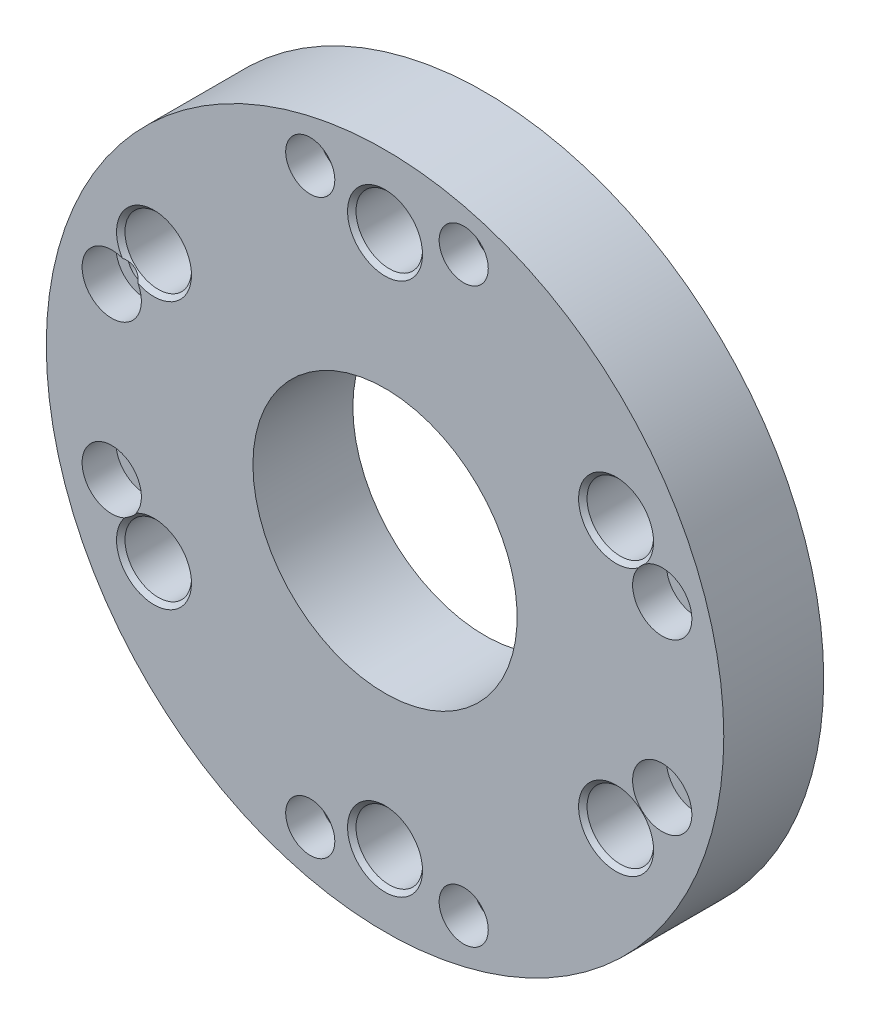
ISO-10303-21;
HEADER;
FILE_DESCRIPTION(('STEP AP214'),'2;1');
FILE_NAME('part.step','',(''),(''),'','','');
FILE_SCHEMA(('AUTOMOTIVE_DESIGN { 1 0 10303 214 1 1 1 1 }'));
ENDSEC;
DATA;
#1=APPLICATION_CONTEXT('core data for automotive mechanical design processes');
#2=APPLICATION_PROTOCOL_DEFINITION('international standard','automotive_design',2000,#1);
#3=PRODUCT_CONTEXT('',#1,'mechanical');
#4=PRODUCT('Part','Part','',(#3));
#5=PRODUCT_RELATED_PRODUCT_CATEGORY('part','',(#4));
#6=PRODUCT_DEFINITION_FORMATION('','',#4);
#7=PRODUCT_DEFINITION_CONTEXT('part definition',#1,'design');
#8=PRODUCT_DEFINITION('design','',#6,#7);
#9=PRODUCT_DEFINITION_SHAPE('','',#8);
#10=(LENGTH_UNIT() NAMED_UNIT(*) SI_UNIT(.MILLI.,.METRE.));
#11=(NAMED_UNIT(*) PLANE_ANGLE_UNIT() SI_UNIT($,.RADIAN.));
#12=(NAMED_UNIT(*) SI_UNIT($,.STERADIAN.) SOLID_ANGLE_UNIT());
#13=UNCERTAINTY_MEASURE_WITH_UNIT(LENGTH_MEASURE(1.E-05),#10,'distance_accuracy_value','');
#14=(GEOMETRIC_REPRESENTATION_CONTEXT(3) GLOBAL_UNCERTAINTY_ASSIGNED_CONTEXT((#13)) GLOBAL_UNIT_ASSIGNED_CONTEXT((#10,
#11,#12)) REPRESENTATION_CONTEXT('',''));
#15=CARTESIAN_POINT('',(0.,0.,0.));
#16=DIRECTION('',(0.,0.,1.));
#17=DIRECTION('',(1.,0.,0.));
#18=AXIS2_PLACEMENT_3D('',#15,#16,#17);
#19=CARTESIAN_POINT('',(32.7306438468949,10.1245664997554,11.8));
#20=DIRECTION('',(0.,0.,-1.));
#21=DIRECTION('',(-1.,0.,0.));
#22=AXIS2_PLACEMENT_3D('',#19,#20,#21);
#23=CYLINDRICAL_SURFACE('',#22,2.15);
#24=CARTESIAN_POINT('',(32.7306438468949,10.1245664997554,0.));
#25=DIRECTION('',(0.,0.,-1.));
#26=DIRECTION('',(-1.,0.,0.));
#27=AXIS2_PLACEMENT_3D('',#24,#25,#26);
#28=CIRCLE('',#27,2.15);
#29=CARTESIAN_POINT('',(30.5806438468949,10.1245664997554,0.));
#30=VERTEX_POINT('',#29);
#31=EDGE_CURVE('E189',#30,#30,#28,.T.);
#32=ORIENTED_EDGE('',*,*,#31,.T.);
#33=EDGE_LOOP('',(#32));
#34=FACE_BOUND('',#33,.T.);
#35=CARTESIAN_POINT('',(32.7306438468949,10.1245664997554,7.8));
#36=DIRECTION('',(0.,0.,1.));
#37=DIRECTION('',(1.,0.,0.));
#38=AXIS2_PLACEMENT_3D('',#35,#36,#37);
#39=CIRCLE('',#38,2.15);
#40=CARTESIAN_POINT('',(34.8806438468949,10.1245664997554,7.8));
#41=VERTEX_POINT('',#40);
#42=EDGE_CURVE('E173',#41,#41,#39,.F.);
#43=ORIENTED_EDGE('',*,*,#42,.F.);
#44=EDGE_LOOP('',(#43));
#45=FACE_BOUND('',#44,.T.);
#46=ADVANCED_FACE('F45',(#34,#45),#23,.F.);
#47=CARTESIAN_POINT('',(9.29064384689489,-33.6854335002446,11.8));
#48=DIRECTION('',(0.,0.,-1.));
#49=DIRECTION('',(-1.,0.,0.));
#50=AXIS2_PLACEMENT_3D('',#47,#48,#49);
#51=CYLINDRICAL_SURFACE('',#50,1.75);
#52=CARTESIAN_POINT('',(9.29064384689489,-33.6854335002446,0.));
#53=DIRECTION('',(0.,0.,-1.));
#54=DIRECTION('',(1.,0.,0.));
#55=AXIS2_PLACEMENT_3D('',#52,#53,#54);
#56=CIRCLE('',#55,1.75);
#57=CARTESIAN_POINT('',(11.0406438468949,-33.6854335002446,0.));
#58=VERTEX_POINT('',#57);
#59=EDGE_CURVE('E144',#58,#58,#56,.T.);
#60=ORIENTED_EDGE('',*,*,#59,.T.);
#61=EDGE_LOOP('',(#60));
#62=FACE_BOUND('',#61,.T.);
#63=CARTESIAN_POINT('',(9.29064384689489,-33.6854335002446,7.8));
#64=DIRECTION('',(0.,0.,1.));
#65=DIRECTION('',(1.,0.,0.));
#66=AXIS2_PLACEMENT_3D('',#63,#64,#65);
#67=CIRCLE('',#66,1.75);
#68=CARTESIAN_POINT('',(11.0406438468949,-33.6854335002446,7.8));
#69=VERTEX_POINT('',#68);
#70=EDGE_CURVE('E236',#69,#69,#67,.F.);
#71=ORIENTED_EDGE('',*,*,#70,.F.);
#72=EDGE_LOOP('',(#71));
#73=FACE_BOUND('',#72,.T.);
#74=ADVANCED_FACE('F327',(#62,#73),#51,.F.);
#75=CARTESIAN_POINT('',(-8.82935615310511,-33.6854335002446,11.8));
#76=DIRECTION('',(0.,0.,-1.));
#77=DIRECTION('',(-1.,0.,0.));
#78=AXIS2_PLACEMENT_3D('',#75,#76,#77);
#79=CYLINDRICAL_SURFACE('',#78,1.75);
#80=CARTESIAN_POINT('',(-8.82935615310511,-33.6854335002446,0.));
#81=DIRECTION('',(0.,0.,-1.));
#82=DIRECTION('',(-1.,0.,0.));
#83=AXIS2_PLACEMENT_3D('',#80,#81,#82);
#84=CIRCLE('',#83,1.75);
#85=CARTESIAN_POINT('',(-10.5793561531051,-33.6854335002446,0.));
#86=VERTEX_POINT('',#85);
#87=EDGE_CURVE('E178',#86,#86,#84,.T.);
#88=ORIENTED_EDGE('',*,*,#87,.T.);
#89=EDGE_LOOP('',(#88));
#90=FACE_BOUND('',#89,.T.);
#91=CARTESIAN_POINT('',(-8.82935615310511,-33.6854335002446,7.8));
#92=DIRECTION('',(0.,0.,1.));
#93=DIRECTION('',(1.,0.,0.));
#94=AXIS2_PLACEMENT_3D('',#91,#92,#93);
#95=CIRCLE('',#94,1.75);
#96=CARTESIAN_POINT('',(-7.07935615310511,-33.6854335002446,7.8));
#97=VERTEX_POINT('',#96);
#98=EDGE_CURVE('E232',#97,#97,#95,.F.);
#99=ORIENTED_EDGE('',*,*,#98,.F.);
#100=EDGE_LOOP('',(#99));
#101=FACE_BOUND('',#100,.T.);
#102=ADVANCED_FACE('F332',(#90,#101),#79,.F.);
#103=CARTESIAN_POINT('',(-8.82935615310511,33.9345664997554,11.8));
#104=DIRECTION('',(0.,0.,-1.));
#105=DIRECTION('',(-1.,0.,0.));
#106=AXIS2_PLACEMENT_3D('',#103,#104,#105);
#107=CYLINDRICAL_SURFACE('',#106,1.75);
#108=CARTESIAN_POINT('',(-8.82935615310511,33.9345664997554,0.));
#109=DIRECTION('',(0.,0.,-1.));
#110=DIRECTION('',(1.,0.,0.));
#111=AXIS2_PLACEMENT_3D('',#108,#109,#110);
#112=CIRCLE('',#111,1.75);
#113=CARTESIAN_POINT('',(-7.07935615310511,33.9345664997554,0.));
#114=VERTEX_POINT('',#113);
#115=EDGE_CURVE('E174',#114,#114,#112,.T.);
#116=ORIENTED_EDGE('',*,*,#115,.T.);
#117=EDGE_LOOP('',(#116));
#118=FACE_BOUND('',#117,.T.);
#119=CARTESIAN_POINT('',(-8.82935615310511,33.9345664997554,7.8));
#120=DIRECTION('',(0.,0.,1.));
#121=DIRECTION('',(1.,0.,0.));
#122=AXIS2_PLACEMENT_3D('',#119,#120,#121);
#123=CIRCLE('',#122,1.75);
#124=CARTESIAN_POINT('',(-7.07935615310511,33.9345664997554,7.8));
#125=VERTEX_POINT('',#124);
#126=EDGE_CURVE('E228',#125,#125,#123,.F.);
#127=ORIENTED_EDGE('',*,*,#126,.F.);
#128=EDGE_LOOP('',(#127));
#129=FACE_BOUND('',#128,.T.);
#130=ADVANCED_FACE('F513',(#118,#129),#107,.F.);
#131=CARTESIAN_POINT('',(9.29064384689489,33.9345664997554,11.8));
#132=DIRECTION('',(0.,0.,-1.));
#133=DIRECTION('',(-1.,0.,0.));
#134=AXIS2_PLACEMENT_3D('',#131,#132,#133);
#135=CYLINDRICAL_SURFACE('',#134,1.75);
#136=CARTESIAN_POINT('',(9.29064384689489,33.9345664997554,0.));
#137=DIRECTION('',(0.,0.,-1.));
#138=DIRECTION('',(-1.,0.,0.));
#139=AXIS2_PLACEMENT_3D('',#136,#137,#138);
#140=CIRCLE('',#139,1.75);
#141=CARTESIAN_POINT('',(7.54064384689489,33.9345664997554,0.));
#142=VERTEX_POINT('',#141);
#143=EDGE_CURVE('E177',#142,#142,#140,.T.);
#144=ORIENTED_EDGE('',*,*,#143,.T.);
#145=EDGE_LOOP('',(#144));
#146=FACE_BOUND('',#145,.T.);
#147=CARTESIAN_POINT('',(9.29064384689489,33.9345664997554,7.8));
#148=DIRECTION('',(0.,0.,1.));
#149=DIRECTION('',(1.,0.,0.));
#150=AXIS2_PLACEMENT_3D('',#147,#148,#149);
#151=CIRCLE('',#150,1.75);
#152=CARTESIAN_POINT('',(11.0406438468949,33.9345664997554,7.8));
#153=VERTEX_POINT('',#152);
#154=EDGE_CURVE('E224',#153,#153,#151,.F.);
#155=ORIENTED_EDGE('',*,*,#154,.F.);
#156=EDGE_LOOP('',(#155));
#157=FACE_BOUND('',#156,.T.);
#158=ADVANCED_FACE('F338',(#146,#157),#135,.F.);
#159=CARTESIAN_POINT('',(-32.2693561531051,10.1245664997554,11.8));
#160=DIRECTION('',(0.,0.,-1.));
#161=DIRECTION('',(-1.,0.,0.));
#162=AXIS2_PLACEMENT_3D('',#159,#160,#161);
#163=CYLINDRICAL_SURFACE('',#162,2.15);
#164=CARTESIAN_POINT('',(-32.2693561531051,10.1245664997554,0.));
#165=DIRECTION('',(0.,0.,-1.));
#166=DIRECTION('',(1.,0.,0.));
#167=AXIS2_PLACEMENT_3D('',#164,#165,#166);
#168=CIRCLE('',#167,2.15);
#169=CARTESIAN_POINT('',(-30.1193561531051,10.1245664997554,0.));
#170=VERTEX_POINT('',#169);
#171=EDGE_CURVE('E194',#170,#170,#168,.T.);
#172=ORIENTED_EDGE('',*,*,#171,.T.);
#173=EDGE_LOOP('',(#172));
#174=FACE_BOUND('',#173,.T.);
#175=CARTESIAN_POINT('',(-32.2693561531051,10.1245664997554,7.8));
#176=DIRECTION('',(0.,0.,1.));
#177=DIRECTION('',(1.,0.,0.));
#178=AXIS2_PLACEMENT_3D('',#175,#176,#177);
#179=CIRCLE('',#178,2.15);
#180=CARTESIAN_POINT('',(-30.1193561531051,10.1245664997554,7.8));
#181=VERTEX_POINT('',#180);
#182=EDGE_CURVE('E220',#181,#181,#179,.F.);
#183=ORIENTED_EDGE('',*,*,#182,.F.);
#184=EDGE_LOOP('',(#183));
#185=FACE_BOUND('',#184,.T.);
#186=ADVANCED_FACE('F525',(#174,#185),#163,.F.);
#187=CARTESIAN_POINT('',(-32.2693561531051,-9.87543350024464,11.8));
#188=DIRECTION('',(0.,0.,-1.));
#189=DIRECTION('',(-1.,0.,0.));
#190=AXIS2_PLACEMENT_3D('',#187,#188,#189);
#191=CYLINDRICAL_SURFACE('',#190,2.15);
#192=CARTESIAN_POINT('',(-32.2693561531051,-9.87543350024464,0.));
#193=DIRECTION('',(0.,0.,-1.));
#194=DIRECTION('',(-1.,0.,0.));
#195=AXIS2_PLACEMENT_3D('',#192,#193,#194);
#196=CIRCLE('',#195,2.15);
#197=CARTESIAN_POINT('',(-34.4193561531051,-9.87543350024464,0.));
#198=VERTEX_POINT('',#197);
#199=EDGE_CURVE('E190',#198,#198,#196,.T.);
#200=ORIENTED_EDGE('',*,*,#199,.T.);
#201=EDGE_LOOP('',(#200));
#202=FACE_BOUND('',#201,.T.);
#203=CARTESIAN_POINT('',(-32.2693561531051,-9.87543350024464,7.8));
#204=DIRECTION('',(0.,0.,1.));
#205=DIRECTION('',(1.,0.,0.));
#206=AXIS2_PLACEMENT_3D('',#203,#204,#205);
#207=CIRCLE('',#206,2.15);
#208=CARTESIAN_POINT('',(-30.1193561531051,-9.87543350024464,7.8));
#209=VERTEX_POINT('',#208);
#210=EDGE_CURVE('E216',#209,#209,#207,.F.);
#211=ORIENTED_EDGE('',*,*,#210,.F.);
#212=EDGE_LOOP('',(#211));
#213=FACE_BOUND('',#212,.T.);
#214=ADVANCED_FACE('F522',(#202,#213),#191,.F.);
#215=CARTESIAN_POINT('',(32.7306438468949,-9.87543350024464,11.8));
#216=DIRECTION('',(0.,0.,-1.));
#217=DIRECTION('',(-1.,0.,0.));
#218=AXIS2_PLACEMENT_3D('',#215,#216,#217);
#219=CYLINDRICAL_SURFACE('',#218,2.15);
#220=CARTESIAN_POINT('',(32.7306438468949,-9.87543350024464,0.));
#221=DIRECTION('',(0.,0.,-1.));
#222=DIRECTION('',(1.,0.,0.));
#223=AXIS2_PLACEMENT_3D('',#220,#221,#222);
#224=CIRCLE('',#223,2.15);
#225=CARTESIAN_POINT('',(34.8806438468949,-9.87543350024464,0.));
#226=VERTEX_POINT('',#225);
#227=EDGE_CURVE('E185',#226,#226,#224,.T.);
#228=ORIENTED_EDGE('',*,*,#227,.T.);
#229=EDGE_LOOP('',(#228));
#230=FACE_BOUND('',#229,.T.);
#231=CARTESIAN_POINT('',(32.7306438468949,-9.87543350024464,7.8));
#232=DIRECTION('',(0.,0.,1.));
#233=DIRECTION('',(1.,0.,0.));
#234=AXIS2_PLACEMENT_3D('',#231,#232,#233);
#235=CIRCLE('',#234,2.15);
#236=CARTESIAN_POINT('',(34.8806438468949,-9.87543350024464,7.8));
#237=VERTEX_POINT('',#236);
#238=EDGE_CURVE('E137',#237,#237,#235,.F.);
#239=ORIENTED_EDGE('',*,*,#238,.F.);
#240=EDGE_LOOP('',(#239));
#241=FACE_BOUND('',#240,.T.);
#242=ADVANCED_FACE('F350',(#230,#241),#219,.F.);
#243=CARTESIAN_POINT('',(0.,0.,11.8));
#244=DIRECTION('',(0.,0.,-1.));
#245=DIRECTION('',(-1.,0.,0.));
#246=AXIS2_PLACEMENT_3D('',#243,#244,#245);
#247=CYLINDRICAL_SURFACE('',#246,40.);
#248=CARTESIAN_POINT('',(0.,0.,11.8));
#249=DIRECTION('',(0.,0.,1.));
#250=DIRECTION('',(1.,0.,0.));
#251=AXIS2_PLACEMENT_3D('',#248,#249,#250);
#252=CIRCLE('',#251,40.);
#253=CARTESIAN_POINT('',(40.,0.,11.8));
#254=VERTEX_POINT('',#253);
#255=EDGE_CURVE('E205',#254,#254,#252,.T.);
#256=ORIENTED_EDGE('',*,*,#255,.F.);
#257=EDGE_LOOP('',(#256));
#258=FACE_BOUND('',#257,.T.);
#259=CARTESIAN_POINT('',(0.,0.,0.));
#260=DIRECTION('',(0.,0.,1.));
#261=DIRECTION('',(1.,0.,0.));
#262=AXIS2_PLACEMENT_3D('',#259,#260,#261);
#263=CIRCLE('',#262,40.);
#264=CARTESIAN_POINT('',(40.,0.,0.));
#265=VERTEX_POINT('',#264);
#266=EDGE_CURVE('E204',#265,#265,#263,.T.);
#267=ORIENTED_EDGE('',*,*,#266,.T.);
#268=EDGE_LOOP('',(#267));
#269=FACE_BOUND('',#268,.T.);
#270=ADVANCED_FACE('F343',(#258,#269),#247,.T.);
#271=CARTESIAN_POINT('',(0.,0.,11.8));
#272=DIRECTION('',(0.,0.,1.));
#273=DIRECTION('',(1.,0.,0.));
#274=AXIS2_PLACEMENT_3D('',#271,#272,#273);
#275=PLANE('',#274);
#276=CARTESIAN_POINT('',(2.19963324347117E-13,-31.5,11.8));
#277=DIRECTION('',(0.,0.,1.));
#278=DIRECTION('',(1.,0.,0.));
#279=AXIS2_PLACEMENT_3D('',#276,#277,#278);
#280=CIRCLE('',#279,4.425);
#281=CARTESIAN_POINT('',(4.42500000000022,-31.5,11.8));
#282=VERTEX_POINT('',#281);
#283=EDGE_CURVE('E255',#282,#282,#280,.F.);
#284=ORIENTED_EDGE('',*,*,#283,.T.);
#285=EDGE_LOOP('',(#284));
#286=FACE_BOUND('',#285,.T.);
#287=CARTESIAN_POINT('',(27.27980021921,-15.7499999999997,11.8));
#288=DIRECTION('',(0.,0.,1.));
#289=DIRECTION('',(1.,0.,0.));
#290=AXIS2_PLACEMENT_3D('',#287,#288,#289);
#291=CIRCLE('',#290,4.42500000000001);
#292=CARTESIAN_POINT('',(31.70480021921,-15.7499999999997,11.8));
#293=VERTEX_POINT('',#292);
#294=EDGE_CURVE('E96',#293,#293,#291,.F.);
#295=ORIENTED_EDGE('',*,*,#294,.T.);
#296=EDGE_LOOP('',(#295));
#297=FACE_BOUND('',#296,.T.);
#298=CARTESIAN_POINT('',(0.,31.5,11.8));
#299=DIRECTION('',(0.,0.,1.));
#300=DIRECTION('',(1.,0.,0.));
#301=AXIS2_PLACEMENT_3D('',#298,#299,#300);
#302=CIRCLE('',#301,4.425);
#303=CARTESIAN_POINT('',(4.425,31.5,11.8));
#304=VERTEX_POINT('',#303);
#305=EDGE_CURVE('E97',#304,#304,#302,.F.);
#306=ORIENTED_EDGE('',*,*,#305,.T.);
#307=EDGE_LOOP('',(#306));
#308=FACE_BOUND('',#307,.T.);
#309=CARTESIAN_POINT('',(32.7306438468949,10.1245664997554,11.8));
#310=DIRECTION('',(0.,0.,1.));
#311=DIRECTION('',(1.,0.,0.));
#312=AXIS2_PLACEMENT_3D('',#309,#310,#311);
#313=CIRCLE('',#312,3.5);
#314=CARTESIAN_POINT('',(29.9017074809566,12.1854204580629,11.8));
#315=VERTEX_POINT('',#314);
#316=CARTESIAN_POINT('',(30.7599737938672,13.0170497826975,11.8));
#317=VERTEX_POINT('',#316);
#318=EDGE_CURVE('E94',#315,#317,#313,.T.);
#319=ORIENTED_EDGE('',*,*,#318,.F.);
#320=CARTESIAN_POINT('',(27.2798002192096,15.7500000000003,11.8));
#321=DIRECTION('',(0.,0.,1.));
#322=DIRECTION('',(1.,0.,0.));
#323=AXIS2_PLACEMENT_3D('',#320,#321,#322);
#324=CIRCLE('',#323,4.42500000000002);
#325=EDGE_CURVE('E83',#315,#317,#324,.F.);
#326=ORIENTED_EDGE('',*,*,#325,.T.);
#327=EDGE_LOOP('',(#319,#326));
#328=FACE_BOUND('',#327,.T.);
#329=CARTESIAN_POINT('',(-32.2693561531051,-9.87543350024464,11.8));
#330=DIRECTION('',(0.,0.,1.));
#331=DIRECTION('',(1.,0.,0.));
#332=AXIS2_PLACEMENT_3D('',#329,#330,#331);
#333=CIRCLE('',#332,3.5);
#334=CARTESIAN_POINT('',(-29.3848682957069,-11.8577881104298,11.8));
#335=VERTEX_POINT('',#334);
#336=CARTESIAN_POINT('',(-30.7799908733153,-13.0427337801923,11.8));
#337=VERTEX_POINT('',#336);
#338=EDGE_CURVE('E108',#335,#337,#333,.T.);
#339=ORIENTED_EDGE('',*,*,#338,.F.);
#340=CARTESIAN_POINT('',(-27.2798002192098,-15.7500000000001,11.8));
#341=DIRECTION('',(0.,0.,1.));
#342=DIRECTION('',(1.,0.,0.));
#343=AXIS2_PLACEMENT_3D('',#340,#341,#342);
#344=CIRCLE('',#343,4.42500000000001);
#345=EDGE_CURVE('E251',#335,#337,#344,.F.);
#346=ORIENTED_EDGE('',*,*,#345,.T.);
#347=EDGE_LOOP('',(#339,#346));
#348=FACE_BOUND('',#347,.T.);
#349=CARTESIAN_POINT('',(-8.82935615310511,-33.6854335002446,11.8));
#350=DIRECTION('',(0.,0.,1.));
#351=DIRECTION('',(1.,0.,0.));
#352=AXIS2_PLACEMENT_3D('',#349,#350,#351);
#353=CIRCLE('',#352,2.9);
#354=CARTESIAN_POINT('',(-5.92935615310511,-33.6854335002446,11.8));
#355=VERTEX_POINT('',#354);
#356=EDGE_CURVE('E125',#355,#355,#353,.T.);
#357=ORIENTED_EDGE('',*,*,#356,.F.);
#358=EDGE_LOOP('',(#357));
#359=FACE_BOUND('',#358,.T.);
#360=CARTESIAN_POINT('',(-8.82935615310511,33.9345664997554,11.8));
#361=DIRECTION('',(0.,0.,1.));
#362=DIRECTION('',(1.,0.,0.));
#363=AXIS2_PLACEMENT_3D('',#360,#361,#362);
#364=CIRCLE('',#363,2.9);
#365=CARTESIAN_POINT('',(-5.92935615310511,33.9345664997554,11.8));
#366=VERTEX_POINT('',#365);
#367=EDGE_CURVE('E116',#366,#366,#364,.T.);
#368=ORIENTED_EDGE('',*,*,#367,.F.);
#369=EDGE_LOOP('',(#368));
#370=FACE_BOUND('',#369,.T.);
#371=CARTESIAN_POINT('',(9.29064384689489,33.9345664997554,11.8));
#372=DIRECTION('',(0.,0.,1.));
#373=DIRECTION('',(1.,0.,0.));
#374=AXIS2_PLACEMENT_3D('',#371,#372,#373);
#375=CIRCLE('',#374,2.9);
#376=CARTESIAN_POINT('',(12.1906438468949,33.9345664997554,11.8));
#377=VERTEX_POINT('',#376);
#378=EDGE_CURVE('E112',#377,#377,#375,.T.);
#379=ORIENTED_EDGE('',*,*,#378,.F.);
#380=EDGE_LOOP('',(#379));
#381=FACE_BOUND('',#380,.T.);
#382=CARTESIAN_POINT('',(32.7306438468949,-9.87543350024464,11.8));
#383=DIRECTION('',(0.,0.,1.));
#384=DIRECTION('',(1.,0.,0.));
#385=AXIS2_PLACEMENT_3D('',#382,#383,#384);
#386=CIRCLE('',#385,3.5);
#387=CARTESIAN_POINT('',(36.2306438468949,-9.87543350024464,11.8));
#388=VERTEX_POINT('',#387);
#389=EDGE_CURVE('E402',#388,#388,#386,.T.);
#390=ORIENTED_EDGE('',*,*,#389,.F.);
#391=EDGE_LOOP('',(#390));
#392=FACE_BOUND('',#391,.T.);
#393=CARTESIAN_POINT('',(9.29064384689489,-33.6854335002446,11.8));
#394=DIRECTION('',(0.,0.,1.));
#395=DIRECTION('',(1.,0.,0.));
#396=AXIS2_PLACEMENT_3D('',#393,#394,#395);
#397=CIRCLE('',#396,2.9);
#398=CARTESIAN_POINT('',(12.1906438468949,-33.6854335002446,11.8));
#399=VERTEX_POINT('',#398);
#400=EDGE_CURVE('E394',#399,#399,#397,.T.);
#401=ORIENTED_EDGE('',*,*,#400,.F.);
#402=EDGE_LOOP('',(#401));
#403=FACE_BOUND('',#402,.T.);
#404=CARTESIAN_POINT('',(-32.2693561531051,10.1245664997554,11.8));
#405=DIRECTION('',(0.,0.,1.));
#406=DIRECTION('',(1.,0.,0.));
#407=AXIS2_PLACEMENT_3D('',#404,#405,#406);
#408=CIRCLE('',#407,3.5);
#409=CARTESIAN_POINT('',(-31.0271537425573,13.3967115410439,11.8));
#410=VERTEX_POINT('',#409);
#411=CARTESIAN_POINT('',(-29.1689040496499,11.7485113122967,11.8));
#412=VERTEX_POINT('',#411);
#413=EDGE_CURVE('E120',#410,#412,#408,.T.);
#414=ORIENTED_EDGE('',*,*,#413,.F.);
#415=CARTESIAN_POINT('',(-27.2798002192099,15.7499999999999,11.8));
#416=DIRECTION('',(0.,0.,1.));
#417=DIRECTION('',(1.,0.,0.));
#418=AXIS2_PLACEMENT_3D('',#415,#416,#417);
#419=CIRCLE('',#418,4.42500000000001);
#420=EDGE_CURVE('E209',#410,#412,#419,.F.);
#421=ORIENTED_EDGE('',*,*,#420,.T.);
#422=EDGE_LOOP('',(#414,#421));
#423=FACE_BOUND('',#422,.T.);
#424=CARTESIAN_POINT('',(0.,0.,11.8));
#425=DIRECTION('',(0.,0.,-1.));
#426=DIRECTION('',(-1.,0.,0.));
#427=AXIS2_PLACEMENT_3D('',#424,#425,#426);
#428=CIRCLE('',#427,15.6);
#429=CARTESIAN_POINT('',(-15.6,0.,11.8));
#430=VERTEX_POINT('',#429);
#431=EDGE_CURVE('E159',#430,#430,#428,.T.);
#432=ORIENTED_EDGE('',*,*,#431,.T.);
#433=EDGE_LOOP('',(#432));
#434=FACE_BOUND('',#433,.T.);
#435=ORIENTED_EDGE('',*,*,#255,.T.);
#436=EDGE_LOOP('',(#435));
#437=FACE_BOUND('',#436,.T.);
#438=ADVANCED_FACE('F92',(#286,#297,#308,#328,#348,#359,#370,#381,#392,#403,#423,#434,#437),
#275,.T.);
#439=CARTESIAN_POINT('',(0.,0.,0.));
#440=DIRECTION('',(0.,0.,1.));
#441=DIRECTION('',(1.,0.,0.));
#442=AXIS2_PLACEMENT_3D('',#439,#440,#441);
#443=PLANE('',#442);
#444=CARTESIAN_POINT('',(0.,31.5,0.));
#445=DIRECTION('',(0.,0.,-1.));
#446=DIRECTION('',(-1.,0.,0.));
#447=AXIS2_PLACEMENT_3D('',#444,#445,#446);
#448=CIRCLE('',#447,3.925);
#449=CARTESIAN_POINT('',(-3.925,31.5,0.));
#450=VERTEX_POINT('',#449);
#451=EDGE_CURVE('E140',#450,#450,#448,.T.);
#452=ORIENTED_EDGE('',*,*,#451,.F.);
#453=EDGE_LOOP('',(#452));
#454=FACE_BOUND('',#453,.T.);
#455=CARTESIAN_POINT('',(2.19963324347117E-13,-31.5,0.));
#456=DIRECTION('',(0.,0.,-1.));
#457=DIRECTION('',(-1.,0.,0.));
#458=AXIS2_PLACEMENT_3D('',#455,#456,#457);
#459=CIRCLE('',#458,3.925);
#460=CARTESIAN_POINT('',(-3.92499999999978,-31.5,0.));
#461=VERTEX_POINT('',#460);
#462=EDGE_CURVE('E151',#461,#461,#459,.T.);
#463=ORIENTED_EDGE('',*,*,#462,.F.);
#464=EDGE_LOOP('',(#463));
#465=FACE_BOUND('',#464,.T.);
#466=CARTESIAN_POINT('',(-27.2798002192098,-15.7500000000001,0.));
#467=DIRECTION('',(0.,0.,-1.));
#468=DIRECTION('',(-1.,0.,0.));
#469=AXIS2_PLACEMENT_3D('',#466,#467,#468);
#470=CIRCLE('',#469,3.925);
#471=CARTESIAN_POINT('',(-31.2048002192098,-15.7500000000001,0.));
#472=VERTEX_POINT('',#471);
#473=EDGE_CURVE('E146',#472,#472,#470,.T.);
#474=ORIENTED_EDGE('',*,*,#473,.F.);
#475=EDGE_LOOP('',(#474));
#476=FACE_BOUND('',#475,.T.);
#477=CARTESIAN_POINT('',(-27.2798002192099,15.7499999999999,0.));
#478=DIRECTION('',(0.,0.,-1.));
#479=DIRECTION('',(-1.,0.,0.));
#480=AXIS2_PLACEMENT_3D('',#477,#478,#479);
#481=CIRCLE('',#480,3.925);
#482=CARTESIAN_POINT('',(-31.2048002192099,15.7499999999999,0.));
#483=VERTEX_POINT('',#482);
#484=EDGE_CURVE('E150',#483,#483,#481,.T.);
#485=ORIENTED_EDGE('',*,*,#484,.F.);
#486=EDGE_LOOP('',(#485));
#487=FACE_BOUND('',#486,.T.);
#488=CARTESIAN_POINT('',(0.,0.,0.));
#489=DIRECTION('',(0.,0.,-1.));
#490=DIRECTION('',(-1.,0.,0.));
#491=AXIS2_PLACEMENT_3D('',#488,#489,#490);
#492=CIRCLE('',#491,15.6);
#493=CARTESIAN_POINT('',(-15.6,0.,0.));
#494=VERTEX_POINT('',#493);
#495=EDGE_CURVE('E145',#494,#494,#492,.T.);
#496=ORIENTED_EDGE('',*,*,#495,.F.);
#497=EDGE_LOOP('',(#496));
#498=FACE_BOUND('',#497,.T.);
#499=CARTESIAN_POINT('',(27.27980021921,-15.7499999999997,0.));
#500=DIRECTION('',(0.,0.,-1.));
#501=DIRECTION('',(-1.,0.,0.));
#502=AXIS2_PLACEMENT_3D('',#499,#500,#501);
#503=CIRCLE('',#502,3.925);
#504=CARTESIAN_POINT('',(23.35480021921,-15.7499999999997,0.));
#505=VERTEX_POINT('',#504);
#506=EDGE_CURVE('E155',#505,#505,#503,.T.);
#507=ORIENTED_EDGE('',*,*,#506,.F.);
#508=EDGE_LOOP('',(#507));
#509=FACE_BOUND('',#508,.T.);
#510=CARTESIAN_POINT('',(27.2798002192096,15.7500000000003,0.));
#511=DIRECTION('',(0.,0.,-1.));
#512=DIRECTION('',(-1.,0.,0.));
#513=AXIS2_PLACEMENT_3D('',#510,#511,#512);
#514=CIRCLE('',#513,3.925);
#515=CARTESIAN_POINT('',(23.3548002192096,15.7500000000003,0.));
#516=VERTEX_POINT('',#515);
#517=EDGE_CURVE('E169',#516,#516,#514,.T.);
#518=ORIENTED_EDGE('',*,*,#517,.F.);
#519=EDGE_LOOP('',(#518));
#520=FACE_BOUND('',#519,.T.);
#521=ORIENTED_EDGE('',*,*,#227,.F.);
#522=EDGE_LOOP('',(#521));
#523=FACE_BOUND('',#522,.T.);
#524=ORIENTED_EDGE('',*,*,#199,.F.);
#525=EDGE_LOOP('',(#524));
#526=FACE_BOUND('',#525,.T.);
#527=ORIENTED_EDGE('',*,*,#171,.F.);
#528=EDGE_LOOP('',(#527));
#529=FACE_BOUND('',#528,.T.);
#530=ORIENTED_EDGE('',*,*,#143,.F.);
#531=EDGE_LOOP('',(#530));
#532=FACE_BOUND('',#531,.T.);
#533=ORIENTED_EDGE('',*,*,#115,.F.);
#534=EDGE_LOOP('',(#533));
#535=FACE_BOUND('',#534,.T.);
#536=ORIENTED_EDGE('',*,*,#87,.F.);
#537=EDGE_LOOP('',(#536));
#538=FACE_BOUND('',#537,.T.);
#539=ORIENTED_EDGE('',*,*,#59,.F.);
#540=EDGE_LOOP('',(#539));
#541=FACE_BOUND('',#540,.T.);
#542=ORIENTED_EDGE('',*,*,#31,.F.);
#543=EDGE_LOOP('',(#542));
#544=FACE_BOUND('',#543,.T.);
#545=ORIENTED_EDGE('',*,*,#266,.F.);
#546=EDGE_LOOP('',(#545));
#547=FACE_BOUND('',#546,.T.);
#548=ADVANCED_FACE('F342',(#454,#465,#476,#487,#498,#509,#520,#523,#526,#529,#532,#535,#538,
#541,#544,#547),#443,.F.);
#549=CARTESIAN_POINT('',(27.2798002192096,15.7500000000003,11.8));
#550=DIRECTION('',(0.,0.,-1.));
#551=DIRECTION('',(-1.,0.,0.));
#552=AXIS2_PLACEMENT_3D('',#549,#550,#551);
#553=CYLINDRICAL_SURFACE('',#552,3.925);
#554=CARTESIAN_POINT('',(27.2798002192096,15.7500000000003,11.3));
#555=DIRECTION('',(0.,0.,1.));
#556=DIRECTION('',(1.,0.,0.));
#557=AXIS2_PLACEMENT_3D('',#554,#555,#556);
#558=CIRCLE('',#557,3.925);
#559=CARTESIAN_POINT('',(31.2048002192096,15.7500000000003,11.3));
#560=VERTEX_POINT('',#559);
#561=EDGE_CURVE('E88',#560,#560,#558,.T.);
#562=ORIENTED_EDGE('',*,*,#561,.T.);
#563=EDGE_LOOP('',(#562));
#564=FACE_BOUND('',#563,.T.);
#565=ORIENTED_EDGE('',*,*,#517,.T.);
#566=EDGE_LOOP('',(#565));
#567=FACE_BOUND('',#566,.T.);
#568=ADVANCED_FACE('F347',(#564,#567),#553,.F.);
#569=CARTESIAN_POINT('',(27.27980021921,-15.7499999999997,11.8));
#570=DIRECTION('',(0.,0.,-1.));
#571=DIRECTION('',(-1.,0.,0.));
#572=AXIS2_PLACEMENT_3D('',#569,#570,#571);
#573=CYLINDRICAL_SURFACE('',#572,3.925);
#574=CARTESIAN_POINT('',(27.27980021921,-15.7499999999997,11.3));
#575=DIRECTION('',(0.,0.,1.));
#576=DIRECTION('',(1.,0.,0.));
#577=AXIS2_PLACEMENT_3D('',#574,#575,#576);
#578=CIRCLE('',#577,3.925);
#579=CARTESIAN_POINT('',(31.20480021921,-15.7499999999997,11.3));
#580=VERTEX_POINT('',#579);
#581=EDGE_CURVE('E89',#580,#580,#578,.T.);
#582=ORIENTED_EDGE('',*,*,#581,.T.);
#583=EDGE_LOOP('',(#582));
#584=FACE_BOUND('',#583,.T.);
#585=ORIENTED_EDGE('',*,*,#506,.T.);
#586=EDGE_LOOP('',(#585));
#587=FACE_BOUND('',#586,.T.);
#588=ADVANCED_FACE('F433',(#584,#587),#573,.F.);
#589=CARTESIAN_POINT('',(0.,0.,11.8));
#590=DIRECTION('',(0.,0.,-1.));
#591=DIRECTION('',(-1.,0.,0.));
#592=AXIS2_PLACEMENT_3D('',#589,#590,#591);
#593=CYLINDRICAL_SURFACE('',#592,15.6);
#594=ORIENTED_EDGE('',*,*,#431,.F.);
#595=EDGE_LOOP('',(#594));
#596=FACE_BOUND('',#595,.T.);
#597=ORIENTED_EDGE('',*,*,#495,.T.);
#598=EDGE_LOOP('',(#597));
#599=FACE_BOUND('',#598,.T.);
#600=ADVANCED_FACE('F429',(#596,#599),#593,.F.);
#601=CARTESIAN_POINT('',(-27.2798002192099,15.7499999999999,11.8));
#602=DIRECTION('',(0.,0.,-1.));
#603=DIRECTION('',(-1.,0.,0.));
#604=AXIS2_PLACEMENT_3D('',#601,#602,#603);
#605=CYLINDRICAL_SURFACE('',#604,3.925);
#606=CARTESIAN_POINT('',(-27.2798002192099,15.7499999999999,11.3));
#607=DIRECTION('',(0.,0.,1.));
#608=DIRECTION('',(1.,0.,0.));
#609=AXIS2_PLACEMENT_3D('',#606,#607,#608);
#610=CIRCLE('',#609,3.925);
#611=CARTESIAN_POINT('',(-23.3548002192099,15.7499999999999,11.3));
#612=VERTEX_POINT('',#611);
#613=EDGE_CURVE('E11',#612,#612,#610,.T.);
#614=ORIENTED_EDGE('',*,*,#613,.T.);
#615=EDGE_LOOP('',(#614));
#616=FACE_BOUND('',#615,.T.);
#617=ORIENTED_EDGE('',*,*,#484,.T.);
#618=EDGE_LOOP('',(#617));
#619=FACE_BOUND('',#618,.T.);
#620=ADVANCED_FACE('F432',(#616,#619),#605,.F.);
#621=CARTESIAN_POINT('',(-27.2798002192098,-15.7500000000001,11.8));
#622=DIRECTION('',(0.,0.,-1.));
#623=DIRECTION('',(-1.,0.,0.));
#624=AXIS2_PLACEMENT_3D('',#621,#622,#623);
#625=CYLINDRICAL_SURFACE('',#624,3.925);
#626=CARTESIAN_POINT('',(-27.2798002192098,-15.7500000000001,11.3));
#627=DIRECTION('',(0.,0.,1.));
#628=DIRECTION('',(1.,0.,0.));
#629=AXIS2_PLACEMENT_3D('',#626,#627,#628);
#630=CIRCLE('',#629,3.925);
#631=CARTESIAN_POINT('',(-23.3548002192098,-15.7500000000001,11.3));
#632=VERTEX_POINT('',#631);
#633=EDGE_CURVE('E272',#632,#632,#630,.T.);
#634=ORIENTED_EDGE('',*,*,#633,.T.);
#635=EDGE_LOOP('',(#634));
#636=FACE_BOUND('',#635,.T.);
#637=ORIENTED_EDGE('',*,*,#473,.T.);
#638=EDGE_LOOP('',(#637));
#639=FACE_BOUND('',#638,.T.);
#640=ADVANCED_FACE('F380',(#636,#639),#625,.F.);
#641=CARTESIAN_POINT('',(2.19963324347117E-13,-31.5,11.8));
#642=DIRECTION('',(0.,0.,-1.));
#643=DIRECTION('',(-1.,0.,0.));
#644=AXIS2_PLACEMENT_3D('',#641,#642,#643);
#645=CYLINDRICAL_SURFACE('',#644,3.925);
#646=CARTESIAN_POINT('',(2.19963324347117E-13,-31.5,11.3));
#647=DIRECTION('',(0.,0.,1.));
#648=DIRECTION('',(1.,0.,0.));
#649=AXIS2_PLACEMENT_3D('',#646,#647,#648);
#650=CIRCLE('',#649,3.925);
#651=CARTESIAN_POINT('',(3.92500000000022,-31.5,11.3));
#652=VERTEX_POINT('',#651);
#653=EDGE_CURVE('E259',#652,#652,#650,.T.);
#654=ORIENTED_EDGE('',*,*,#653,.T.);
#655=EDGE_LOOP('',(#654));
#656=FACE_BOUND('',#655,.T.);
#657=ORIENTED_EDGE('',*,*,#462,.T.);
#658=EDGE_LOOP('',(#657));
#659=FACE_BOUND('',#658,.T.);
#660=ADVANCED_FACE('F555',(#656,#659),#645,.F.);
#661=CARTESIAN_POINT('',(0.,31.5,11.8));
#662=DIRECTION('',(0.,0.,-1.));
#663=DIRECTION('',(-1.,0.,0.));
#664=AXIS2_PLACEMENT_3D('',#661,#662,#663);
#665=CYLINDRICAL_SURFACE('',#664,3.925);
#666=CARTESIAN_POINT('',(0.,31.5,11.3));
#667=DIRECTION('',(0.,0.,1.));
#668=DIRECTION('',(1.,0.,0.));
#669=AXIS2_PLACEMENT_3D('',#666,#667,#668);
#670=CIRCLE('',#669,3.925);
#671=CARTESIAN_POINT('',(3.925,31.5,11.3));
#672=VERTEX_POINT('',#671);
#673=EDGE_CURVE('E499',#672,#672,#670,.T.);
#674=ORIENTED_EDGE('',*,*,#673,.T.);
#675=EDGE_LOOP('',(#674));
#676=FACE_BOUND('',#675,.T.);
#677=ORIENTED_EDGE('',*,*,#451,.T.);
#678=EDGE_LOOP('',(#677));
#679=FACE_BOUND('',#678,.T.);
#680=ADVANCED_FACE('F492',(#676,#679),#665,.F.);
#681=CARTESIAN_POINT('',(32.7306438468949,-9.87543350024464,7.8));
#682=DIRECTION('',(0.,0.,1.));
#683=DIRECTION('',(1.,0.,0.));
#684=AXIS2_PLACEMENT_3D('',#681,#682,#683);
#685=PLANE('',#684);
#686=CARTESIAN_POINT('',(32.7306438468949,-9.87543350024464,7.8));
#687=DIRECTION('',(0.,0.,1.));
#688=DIRECTION('',(1.,0.,0.));
#689=AXIS2_PLACEMENT_3D('',#686,#687,#688);
#690=CIRCLE('',#689,3.5);
#691=CARTESIAN_POINT('',(36.2306438468949,-9.87543350024464,7.8));
#692=VERTEX_POINT('',#691);
#693=EDGE_CURVE('E398',#692,#692,#690,.T.);
#694=ORIENTED_EDGE('',*,*,#693,.T.);
#695=EDGE_LOOP('',(#694));
#696=FACE_BOUND('',#695,.T.);
#697=ORIENTED_EDGE('',*,*,#238,.T.);
#698=EDGE_LOOP('',(#697));
#699=FACE_BOUND('',#698,.T.);
#700=ADVANCED_FACE('F549',(#696,#699),#685,.T.);
#701=CARTESIAN_POINT('',(32.7306438468949,-9.87543350024464,7.8));
#702=DIRECTION('',(0.,0.,1.));
#703=DIRECTION('',(1.,0.,0.));
#704=AXIS2_PLACEMENT_3D('',#701,#702,#703);
#705=CYLINDRICAL_SURFACE('',#704,3.5);
#706=ORIENTED_EDGE('',*,*,#693,.F.);
#707=EDGE_LOOP('',(#706));
#708=FACE_BOUND('',#707,.T.);
#709=ORIENTED_EDGE('',*,*,#389,.T.);
#710=EDGE_LOOP('',(#709));
#711=FACE_BOUND('',#710,.T.);
#712=ADVANCED_FACE('F291',(#708,#711),#705,.F.);
#713=CARTESIAN_POINT('',(-32.2693561531051,-9.87543350024464,7.8));
#714=DIRECTION('',(0.,0.,1.));
#715=DIRECTION('',(1.,0.,0.));
#716=AXIS2_PLACEMENT_3D('',#713,#714,#715);
#717=PLANE('',#716);
#718=CARTESIAN_POINT('',(-32.2693561531051,-9.87543350024464,7.8));
#719=DIRECTION('',(0.,0.,1.));
#720=DIRECTION('',(1.,0.,0.));
#721=AXIS2_PLACEMENT_3D('',#718,#719,#720);
#722=CIRCLE('',#721,3.5);
#723=CARTESIAN_POINT('',(-28.7693561531051,-9.87543350024464,7.8));
#724=VERTEX_POINT('',#723);
#725=EDGE_CURVE('E101',#724,#724,#722,.T.);
#726=ORIENTED_EDGE('',*,*,#725,.T.);
#727=EDGE_LOOP('',(#726));
#728=FACE_BOUND('',#727,.T.);
#729=ORIENTED_EDGE('',*,*,#210,.T.);
#730=EDGE_LOOP('',(#729));
#731=FACE_BOUND('',#730,.T.);
#732=ADVANCED_FACE('F285',(#728,#731),#717,.T.);
#733=CARTESIAN_POINT('',(-32.2693561531051,-9.87543350024464,7.8));
#734=DIRECTION('',(0.,0.,1.));
#735=DIRECTION('',(1.,0.,0.));
#736=AXIS2_PLACEMENT_3D('',#733,#734,#735);
#737=CYLINDRICAL_SURFACE('',#736,3.5);
#738=ORIENTED_EDGE('',*,*,#725,.F.);
#739=EDGE_LOOP('',(#738));
#740=FACE_BOUND('',#739,.T.);
#741=ORIENTED_EDGE('',*,*,#338,.T.);
#742=CARTESIAN_POINT('',(-30.7799908733153,-13.0427337801923,11.8));
#743=CARTESIAN_POINT('',(-30.7369778667107,-13.0225051843635,11.7783556315118));
#744=CARTESIAN_POINT('',(-30.6938787563369,-13.0011698497304,11.757922302793));
#745=CARTESIAN_POINT('',(-30.607587703799,-12.9561646935185,11.7198436073934));
#746=CARTESIAN_POINT('',(-30.5643957147758,-12.9324917674724,11.7022020314543));
#747=CARTESIAN_POINT('',(-30.434766362635,-12.8577507557476,11.6540213415906));
#748=CARTESIAN_POINT('',(-30.3484846599931,-12.8030572016252,11.6283346331833));
#749=CARTESIAN_POINT('',(-30.1782287356632,-12.6839988701512,11.5929068228958));
#750=CARTESIAN_POINT('',(-30.0942780803423,-12.6195612177463,11.5832930824357));
#751=CARTESIAN_POINT('',(-29.9327381990949,-12.4833707209029,11.5818786695094));
#752=CARTESIAN_POINT('',(-29.855132095639,-12.4116385045719,11.5900290281901));
#753=CARTESIAN_POINT('',(-29.7153686699738,-12.2704515326837,11.6212320229145));
#754=CARTESIAN_POINT('',(-29.6524453518314,-12.2014107792595,11.6428202740453));
#755=CARTESIAN_POINT('',(-29.5342838172569,-12.0612492699835,11.6972559666493));
#756=CARTESIAN_POINT('',(-29.4790496289112,-11.9901274473597,11.7301092785482));
#757=CARTESIAN_POINT('',(-29.4130803438228,-11.8983804723712,11.7778791072464));
#758=CARTESIAN_POINT('',(-29.398820760303,-11.8780914901834,11.7887784890363));
#759=CARTESIAN_POINT('',(-29.3848682957069,-11.8577881104298,11.8));
#760=B_SPLINE_CURVE_WITH_KNOTS('',3,(#742,#743,#744,#745,#746,#747,#748,#749,#750,#751,#752,
#753,#754,#755,#756,#757,#758,#759),.UNSPECIFIED.,.F.,.F.,(4,2,2,2,2,2,2,2,4),(0.,
0.156640803211345,0.313492506951851,0.627952350265648,0.944892349625407,1.26095977141596,
1.54747932432852,1.83414841522336,1.9153908730318),.UNSPECIFIED.);
#761=EDGE_CURVE('E263',#337,#335,#760,.T.);
#762=ORIENTED_EDGE('',*,*,#761,.T.);
#763=EDGE_LOOP('',(#741,#762));
#764=FACE_BOUND('',#763,.T.);
#765=ADVANCED_FACE('F279',(#740,#764),#737,.F.);
#766=CARTESIAN_POINT('',(-32.2693561531051,10.1245664997554,7.8));
#767=DIRECTION('',(0.,0.,1.));
#768=DIRECTION('',(1.,0.,0.));
#769=AXIS2_PLACEMENT_3D('',#766,#767,#768);
#770=PLANE('',#769);
#771=CARTESIAN_POINT('',(-32.2693561531051,10.1245664997554,7.8));
#772=DIRECTION('',(0.,0.,1.));
#773=DIRECTION('',(1.,0.,0.));
#774=AXIS2_PLACEMENT_3D('',#771,#772,#773);
#775=CIRCLE('',#774,3.5);
#776=CARTESIAN_POINT('',(-28.7693561531051,10.1245664997554,7.8));
#777=VERTEX_POINT('',#776);
#778=EDGE_CURVE('E133',#777,#777,#775,.T.);
#779=ORIENTED_EDGE('',*,*,#778,.T.);
#780=EDGE_LOOP('',(#779));
#781=FACE_BOUND('',#780,.T.);
#782=ORIENTED_EDGE('',*,*,#182,.T.);
#783=EDGE_LOOP('',(#782));
#784=FACE_BOUND('',#783,.T.);
#785=ADVANCED_FACE('F284',(#781,#784),#770,.T.);
#786=CARTESIAN_POINT('',(-32.2693561531051,10.1245664997554,7.8));
#787=DIRECTION('',(0.,0.,1.));
#788=DIRECTION('',(1.,0.,0.));
#789=AXIS2_PLACEMENT_3D('',#786,#787,#788);
#790=CYLINDRICAL_SURFACE('',#789,3.5);
#791=ORIENTED_EDGE('',*,*,#778,.F.);
#792=EDGE_LOOP('',(#791));
#793=FACE_BOUND('',#792,.T.);
#794=ORIENTED_EDGE('',*,*,#413,.T.);
#795=CARTESIAN_POINT('',(-29.1689040496499,11.7485113122967,11.8));
#796=CARTESIAN_POINT('',(-29.2153304834709,11.8371597033716,11.7397100254452));
#797=CARTESIAN_POINT('',(-29.2669366425972,11.9264160839084,11.6831318508858));
#798=CARTESIAN_POINT('',(-29.3819937946138,12.1056353201522,11.5811427141848));
#799=CARTESIAN_POINT('',(-29.445593872004,12.1955916752223,11.5358911035972));
#800=CARTESIAN_POINT('',(-29.5734605643528,12.3586236477417,11.4682181395036));
#801=CARTESIAN_POINT('',(-29.6358953357858,12.4320412193813,11.4432653005749));
#802=CARTESIAN_POINT('',(-29.7682008463686,12.574792695063,11.4079904010848));
#803=CARTESIAN_POINT('',(-29.8380174183712,12.644151238964,11.3975687716873));
#804=CARTESIAN_POINT('',(-29.983831790387,12.7771382318833,11.3924550960431));
#805=CARTESIAN_POINT('',(-30.059846505168,12.8407499293018,11.397807596266));
#806=CARTESIAN_POINT('',(-30.2158504398394,12.9605628936469,11.423672687013));
#807=CARTESIAN_POINT('',(-30.295864119694,13.0167081303871,11.444293024326));
#808=CARTESIAN_POINT('',(-30.4854705115203,13.1386312436331,11.5077964334744));
#809=CARTESIAN_POINT('',(-30.5955265693644,13.2008047376357,11.5559709514158));
#810=CARTESIAN_POINT('',(-30.8133731089166,13.3096598743611,11.6680103727231));
#811=CARTESIAN_POINT('',(-30.9211745841866,13.3565289708345,11.7316673439733));
#812=CARTESIAN_POINT('',(-31.0271537425573,13.3967115410439,11.8));
#813=B_SPLINE_CURVE_WITH_KNOTS('',3,(#795,#796,#797,#798,#799,#800,#801,#802,#803,#804,#805,
#806,#807,#808,#809,#810,#811,#812),.UNSPECIFIED.,.F.,.F.,(4,2,2,2,2,2,2,2,4),(0.,
0.351270594883831,0.707235798930184,1.00462553768919,1.2999673573524,1.59614402695113,
1.89443101164461,2.29809778040972,2.69661664473927),.UNSPECIFIED.);
#814=EDGE_CURVE('E56',#412,#410,#813,.T.);
#815=ORIENTED_EDGE('',*,*,#814,.T.);
#816=EDGE_LOOP('',(#794,#815));
#817=FACE_BOUND('',#816,.T.);
#818=ADVANCED_FACE('F485',(#793,#817),#790,.F.);
#819=CARTESIAN_POINT('',(9.29064384689489,33.9345664997554,7.8));
#820=DIRECTION('',(0.,0.,1.));
#821=DIRECTION('',(1.,0.,0.));
#822=AXIS2_PLACEMENT_3D('',#819,#820,#821);
#823=PLANE('',#822);
#824=CARTESIAN_POINT('',(9.29064384689489,33.9345664997554,7.8));
#825=DIRECTION('',(0.,0.,1.));
#826=DIRECTION('',(1.,0.,0.));
#827=AXIS2_PLACEMENT_3D('',#824,#825,#826);
#828=CIRCLE('',#827,2.9);
#829=CARTESIAN_POINT('',(12.1906438468949,33.9345664997554,7.8));
#830=VERTEX_POINT('',#829);
#831=EDGE_CURVE('E406',#830,#830,#828,.T.);
#832=ORIENTED_EDGE('',*,*,#831,.T.);
#833=EDGE_LOOP('',(#832));
#834=FACE_BOUND('',#833,.T.);
#835=ORIENTED_EDGE('',*,*,#154,.T.);
#836=EDGE_LOOP('',(#835));
#837=FACE_BOUND('',#836,.T.);
#838=ADVANCED_FACE('F490',(#834,#837),#823,.T.);
#839=CARTESIAN_POINT('',(9.29064384689489,33.9345664997554,7.8));
#840=DIRECTION('',(0.,0.,1.));
#841=DIRECTION('',(1.,0.,0.));
#842=AXIS2_PLACEMENT_3D('',#839,#840,#841);
#843=CYLINDRICAL_SURFACE('',#842,2.9);
#844=ORIENTED_EDGE('',*,*,#831,.F.);
#845=EDGE_LOOP('',(#844));
#846=FACE_BOUND('',#845,.T.);
#847=ORIENTED_EDGE('',*,*,#378,.T.);
#848=EDGE_LOOP('',(#847));
#849=FACE_BOUND('',#848,.T.);
#850=ADVANCED_FACE('F414',(#846,#849),#843,.F.);
#851=CARTESIAN_POINT('',(-8.82935615310511,33.9345664997554,7.8));
#852=DIRECTION('',(0.,0.,1.));
#853=DIRECTION('',(1.,0.,0.));
#854=AXIS2_PLACEMENT_3D('',#851,#852,#853);
#855=PLANE('',#854);
#856=CARTESIAN_POINT('',(-8.82935615310511,33.9345664997554,7.8));
#857=DIRECTION('',(0.,0.,1.));
#858=DIRECTION('',(1.,0.,0.));
#859=AXIS2_PLACEMENT_3D('',#856,#857,#858);
#860=CIRCLE('',#859,2.9);
#861=CARTESIAN_POINT('',(-5.92935615310511,33.9345664997554,7.8));
#862=VERTEX_POINT('',#861);
#863=EDGE_CURVE('E121',#862,#862,#860,.T.);
#864=ORIENTED_EDGE('',*,*,#863,.T.);
#865=EDGE_LOOP('',(#864));
#866=FACE_BOUND('',#865,.T.);
#867=ORIENTED_EDGE('',*,*,#126,.T.);
#868=EDGE_LOOP('',(#867));
#869=FACE_BOUND('',#868,.T.);
#870=ADVANCED_FACE('F481',(#866,#869),#855,.T.);
#871=CARTESIAN_POINT('',(-8.82935615310511,33.9345664997554,7.8));
#872=DIRECTION('',(0.,0.,1.));
#873=DIRECTION('',(1.,0.,0.));
#874=AXIS2_PLACEMENT_3D('',#871,#872,#873);
#875=CYLINDRICAL_SURFACE('',#874,2.9);
#876=ORIENTED_EDGE('',*,*,#863,.F.);
#877=EDGE_LOOP('',(#876));
#878=FACE_BOUND('',#877,.T.);
#879=ORIENTED_EDGE('',*,*,#367,.T.);
#880=EDGE_LOOP('',(#879));
#881=FACE_BOUND('',#880,.T.);
#882=ADVANCED_FACE('F475',(#878,#881),#875,.F.);
#883=CARTESIAN_POINT('',(-8.82935615310511,-33.6854335002446,7.8));
#884=DIRECTION('',(0.,0.,1.));
#885=DIRECTION('',(1.,0.,0.));
#886=AXIS2_PLACEMENT_3D('',#883,#884,#885);
#887=PLANE('',#886);
#888=CARTESIAN_POINT('',(-8.82935615310511,-33.6854335002446,7.8));
#889=DIRECTION('',(0.,0.,1.));
#890=DIRECTION('',(1.,0.,0.));
#891=AXIS2_PLACEMENT_3D('',#888,#889,#890);
#892=CIRCLE('',#891,2.9);
#893=CARTESIAN_POINT('',(-5.92935615310511,-33.6854335002446,7.8));
#894=VERTEX_POINT('',#893);
#895=EDGE_CURVE('E129',#894,#894,#892,.T.);
#896=ORIENTED_EDGE('',*,*,#895,.T.);
#897=EDGE_LOOP('',(#896));
#898=FACE_BOUND('',#897,.T.);
#899=ORIENTED_EDGE('',*,*,#98,.T.);
#900=EDGE_LOOP('',(#899));
#901=FACE_BOUND('',#900,.T.);
#902=ADVANCED_FACE('F468',(#898,#901),#887,.T.);
#903=CARTESIAN_POINT('',(-8.82935615310511,-33.6854335002446,7.8));
#904=DIRECTION('',(0.,0.,1.));
#905=DIRECTION('',(1.,0.,0.));
#906=AXIS2_PLACEMENT_3D('',#903,#904,#905);
#907=CYLINDRICAL_SURFACE('',#906,2.9);
#908=ORIENTED_EDGE('',*,*,#895,.F.);
#909=EDGE_LOOP('',(#908));
#910=FACE_BOUND('',#909,.T.);
#911=ORIENTED_EDGE('',*,*,#356,.T.);
#912=EDGE_LOOP('',(#911));
#913=FACE_BOUND('',#912,.T.);
#914=ADVANCED_FACE('F462',(#910,#913),#907,.F.);
#915=CARTESIAN_POINT('',(9.29064384689489,-33.6854335002446,7.8));
#916=DIRECTION('',(0.,0.,1.));
#917=DIRECTION('',(1.,0.,0.));
#918=AXIS2_PLACEMENT_3D('',#915,#916,#917);
#919=PLANE('',#918);
#920=CARTESIAN_POINT('',(9.29064384689489,-33.6854335002446,7.8));
#921=DIRECTION('',(0.,0.,1.));
#922=DIRECTION('',(1.,0.,0.));
#923=AXIS2_PLACEMENT_3D('',#920,#921,#922);
#924=CIRCLE('',#923,2.9);
#925=CARTESIAN_POINT('',(12.1906438468949,-33.6854335002446,7.8));
#926=VERTEX_POINT('',#925);
#927=EDGE_CURVE('E390',#926,#926,#924,.T.);
#928=ORIENTED_EDGE('',*,*,#927,.T.);
#929=EDGE_LOOP('',(#928));
#930=FACE_BOUND('',#929,.T.);
#931=ORIENTED_EDGE('',*,*,#70,.T.);
#932=EDGE_LOOP('',(#931));
#933=FACE_BOUND('',#932,.T.);
#934=ADVANCED_FACE('F287',(#930,#933),#919,.T.);
#935=CARTESIAN_POINT('',(9.29064384689489,-33.6854335002446,7.8));
#936=DIRECTION('',(0.,0.,1.));
#937=DIRECTION('',(1.,0.,0.));
#938=AXIS2_PLACEMENT_3D('',#935,#936,#937);
#939=CYLINDRICAL_SURFACE('',#938,2.9);
#940=ORIENTED_EDGE('',*,*,#927,.F.);
#941=EDGE_LOOP('',(#940));
#942=FACE_BOUND('',#941,.T.);
#943=ORIENTED_EDGE('',*,*,#400,.T.);
#944=EDGE_LOOP('',(#943));
#945=FACE_BOUND('',#944,.T.);
#946=ADVANCED_FACE('F461',(#942,#945),#939,.F.);
#947=CARTESIAN_POINT('',(32.7306438468949,10.1245664997554,7.8));
#948=DIRECTION('',(0.,0.,1.));
#949=DIRECTION('',(1.,0.,0.));
#950=AXIS2_PLACEMENT_3D('',#947,#948,#949);
#951=PLANE('',#950);
#952=CARTESIAN_POINT('',(32.7306438468949,10.1245664997554,7.8));
#953=DIRECTION('',(0.,0.,1.));
#954=DIRECTION('',(1.,0.,0.));
#955=AXIS2_PLACEMENT_3D('',#952,#953,#954);
#956=CIRCLE('',#955,3.5);
#957=CARTESIAN_POINT('',(36.2306438468949,10.1245664997554,7.8));
#958=VERTEX_POINT('',#957);
#959=EDGE_CURVE('E102',#958,#958,#956,.T.);
#960=ORIENTED_EDGE('',*,*,#959,.T.);
#961=EDGE_LOOP('',(#960));
#962=FACE_BOUND('',#961,.T.);
#963=ORIENTED_EDGE('',*,*,#42,.T.);
#964=EDGE_LOOP('',(#963));
#965=FACE_BOUND('',#964,.T.);
#966=ADVANCED_FACE('F297',(#962,#965),#951,.T.);
#967=CARTESIAN_POINT('',(32.7306438468949,10.1245664997554,7.8));
#968=DIRECTION('',(0.,0.,1.));
#969=DIRECTION('',(1.,0.,0.));
#970=AXIS2_PLACEMENT_3D('',#967,#968,#969);
#971=CYLINDRICAL_SURFACE('',#970,3.5);
#972=ORIENTED_EDGE('',*,*,#959,.F.);
#973=EDGE_LOOP('',(#972));
#974=FACE_BOUND('',#973,.T.);
#975=ORIENTED_EDGE('',*,*,#318,.T.);
#976=CARTESIAN_POINT('',(30.7599737938672,13.0170497826975,11.8));
#977=CARTESIAN_POINT('',(30.7194348882856,12.9894325484216,11.7851710870084));
#978=CARTESIAN_POINT('',(30.6790832252598,12.9606889198466,11.7719331518436));
#979=CARTESIAN_POINT('',(30.5989781673639,12.9009851905587,11.748952574232));
#980=CARTESIAN_POINT('',(30.5592253107615,12.8700232247088,11.7392129154369));
#981=CARTESIAN_POINT('',(30.4437040876678,12.7758930641945,11.7162238918989));
#982=CARTESIAN_POINT('',(30.3691663653876,12.7097818811673,11.708265916805));
#983=CARTESIAN_POINT('',(30.2252193575337,12.57058023445,11.7079055367953));
#984=CARTESIAN_POINT('',(30.1558779009138,12.497419057222,11.7156807567448));
#985=CARTESIAN_POINT('',(30.0568865271252,12.383698392714,11.738666942043));
#986=CARTESIAN_POINT('',(30.0242714531484,12.3445007737628,11.7484565806563));
#987=CARTESIAN_POINT('',(29.9612926361707,12.2654178220908,11.7716234237602));
#988=CARTESIAN_POINT('',(29.9309269527229,12.2255331195806,11.7849974890224));
#989=CARTESIAN_POINT('',(29.9017074809566,12.1854204580629,11.8));
#990=B_SPLINE_CURVE_WITH_KNOTS('',3,(#976,#977,#978,#979,#980,#981,#982,#983,#984,#985,#986,
#987,#988,#989),.UNSPECIFIED.,.F.,.F.,(4,2,2,2,2,2,4),(0.,0.153681291464934,0.307493346951879,
0.605728073674387,0.907348598011075,1.06296394426271,1.21844344597907),.UNSPECIFIED.);
#991=EDGE_CURVE('E80',#317,#315,#990,.T.);
#992=ORIENTED_EDGE('',*,*,#991,.T.);
#993=EDGE_LOOP('',(#975,#992));
#994=FACE_BOUND('',#993,.T.);
#995=ADVANCED_FACE('F99',(#974,#994),#971,.F.);
#996=CARTESIAN_POINT('',(2.19963324347117E-13,-31.5,11.8));
#997=DIRECTION('',(0.,0.,1.));
#998=DIRECTION('',(1.,0.,0.));
#999=AXIS2_PLACEMENT_3D('',#996,#997,#998);
#1000=CONICAL_SURFACE('',#999,4.425,0.785398163397449);
#1001=ORIENTED_EDGE('',*,*,#653,.F.);
#1002=EDGE_LOOP('',(#1001));
#1003=FACE_BOUND('',#1002,.T.);
#1004=ORIENTED_EDGE('',*,*,#283,.F.);
#1005=EDGE_LOOP('',(#1004));
#1006=FACE_BOUND('',#1005,.T.);
#1007=ADVANCED_FACE('F296',(#1003,#1006),#1000,.F.);
#1008=CARTESIAN_POINT('',(-27.2798002192098,-15.7500000000001,11.8));
#1009=DIRECTION('',(0.,0.,1.));
#1010=DIRECTION('',(1.,0.,0.));
#1011=AXIS2_PLACEMENT_3D('',#1008,#1009,#1010);
#1012=CONICAL_SURFACE('',#1011,4.42500000000001,0.785398163397447);
#1013=ORIENTED_EDGE('',*,*,#633,.F.);
#1014=EDGE_LOOP('',(#1013));
#1015=FACE_BOUND('',#1014,.T.);
#1016=ORIENTED_EDGE('',*,*,#761,.F.);
#1017=ORIENTED_EDGE('',*,*,#345,.F.);
#1018=EDGE_LOOP('',(#1016,#1017));
#1019=FACE_BOUND('',#1018,.T.);
#1020=ADVANCED_FACE('F275',(#1015,#1019),#1012,.F.);
#1021=CARTESIAN_POINT('',(27.27980021921,-15.7499999999997,11.8));
#1022=DIRECTION('',(0.,0.,1.));
#1023=DIRECTION('',(1.,0.,0.));
#1024=AXIS2_PLACEMENT_3D('',#1021,#1022,#1023);
#1025=CONICAL_SURFACE('',#1024,4.42500000000001,0.785398163397447);
#1026=ORIENTED_EDGE('',*,*,#581,.F.);
#1027=EDGE_LOOP('',(#1026));
#1028=FACE_BOUND('',#1027,.T.);
#1029=ORIENTED_EDGE('',*,*,#294,.F.);
#1030=EDGE_LOOP('',(#1029));
#1031=FACE_BOUND('',#1030,.T.);
#1032=ADVANCED_FACE('F315',(#1028,#1031),#1025,.F.);
#1033=CARTESIAN_POINT('',(27.2798002192096,15.7500000000003,11.8));
#1034=DIRECTION('',(0.,0.,1.));
#1035=DIRECTION('',(1.,0.,0.));
#1036=AXIS2_PLACEMENT_3D('',#1033,#1034,#1035);
#1037=CONICAL_SURFACE('',#1036,4.42500000000002,0.785398163397444);
#1038=ORIENTED_EDGE('',*,*,#561,.F.);
#1039=EDGE_LOOP('',(#1038));
#1040=FACE_BOUND('',#1039,.T.);
#1041=ORIENTED_EDGE('',*,*,#991,.F.);
#1042=ORIENTED_EDGE('',*,*,#325,.F.);
#1043=EDGE_LOOP('',(#1041,#1042));
#1044=FACE_BOUND('',#1043,.T.);
#1045=ADVANCED_FACE('F82',(#1040,#1044),#1037,.F.);
#1046=CARTESIAN_POINT('',(0.,31.5,11.8));
#1047=DIRECTION('',(0.,0.,1.));
#1048=DIRECTION('',(1.,0.,0.));
#1049=AXIS2_PLACEMENT_3D('',#1046,#1047,#1048);
#1050=CONICAL_SURFACE('',#1049,4.425,0.785398163397447);
#1051=ORIENTED_EDGE('',*,*,#673,.F.);
#1052=EDGE_LOOP('',(#1051));
#1053=FACE_BOUND('',#1052,.T.);
#1054=ORIENTED_EDGE('',*,*,#305,.F.);
#1055=EDGE_LOOP('',(#1054));
#1056=FACE_BOUND('',#1055,.T.);
#1057=ADVANCED_FACE('F314',(#1053,#1056),#1050,.F.);
#1058=CARTESIAN_POINT('',(-27.2798002192099,15.7499999999999,11.8));
#1059=DIRECTION('',(0.,0.,1.));
#1060=DIRECTION('',(1.,0.,0.));
#1061=AXIS2_PLACEMENT_3D('',#1058,#1059,#1060);
#1062=CONICAL_SURFACE('',#1061,4.42500000000001,0.785398163397447);
#1063=ORIENTED_EDGE('',*,*,#613,.F.);
#1064=EDGE_LOOP('',(#1063));
#1065=FACE_BOUND('',#1064,.T.);
#1066=ORIENTED_EDGE('',*,*,#814,.F.);
#1067=ORIENTED_EDGE('',*,*,#420,.F.);
#1068=EDGE_LOOP('',(#1066,#1067));
#1069=FACE_BOUND('',#1068,.T.);
#1070=ADVANCED_FACE('F48',(#1065,#1069),#1062,.F.);
#1071=CLOSED_SHELL('',(#46,#74,#102,#130,#158,#186,#214,#242,#270,#438,#548,#568,#588,#600,#620,
#640,#660,#680,#700,#712,#732,#765,#785,#818,#838,#850,#870,#882,#902,#914,#934,#946,#966,#995,
#1007,#1020,#1032,#1045,#1057,#1070));
#1072=MANIFOLD_SOLID_BREP('B2',#1071);
#1073=ADVANCED_BREP_SHAPE_REPRESENTATION('',(#18,#1072),#14);
#1074=SHAPE_DEFINITION_REPRESENTATION(#9,#1073);
ENDSEC;
END-ISO-10303-21;
